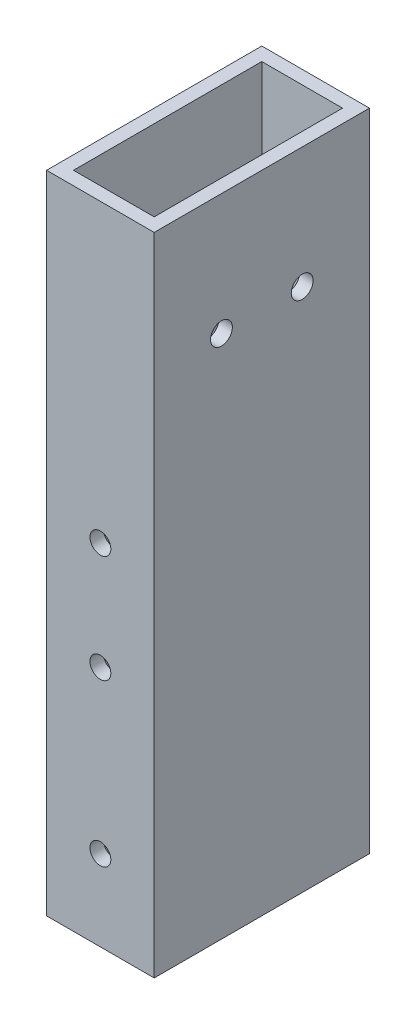
ISO-10303-21;
HEADER;
FILE_DESCRIPTION(('STEP AP214'),'2;1');
FILE_NAME('part.step','',(''),(''),'','','');
FILE_SCHEMA(('AUTOMOTIVE_DESIGN { 1 0 10303 214 1 1 1 1 }'));
ENDSEC;
DATA;
#1=APPLICATION_CONTEXT('core data for automotive mechanical design processes');
#2=APPLICATION_PROTOCOL_DEFINITION('international standard','automotive_design',2000,#1);
#3=PRODUCT_CONTEXT('',#1,'mechanical');
#4=PRODUCT('Part','Part','',(#3));
#5=PRODUCT_RELATED_PRODUCT_CATEGORY('part','',(#4));
#6=PRODUCT_DEFINITION_FORMATION('','',#4);
#7=PRODUCT_DEFINITION_CONTEXT('part definition',#1,'design');
#8=PRODUCT_DEFINITION('design','',#6,#7);
#9=PRODUCT_DEFINITION_SHAPE('','',#8);
#10=(LENGTH_UNIT() NAMED_UNIT(*) SI_UNIT(.MILLI.,.METRE.));
#11=(NAMED_UNIT(*) PLANE_ANGLE_UNIT() SI_UNIT($,.RADIAN.));
#12=(NAMED_UNIT(*) SI_UNIT($,.STERADIAN.) SOLID_ANGLE_UNIT());
#13=UNCERTAINTY_MEASURE_WITH_UNIT(LENGTH_MEASURE(1.E-05),#10,'distance_accuracy_value','');
#14=(GEOMETRIC_REPRESENTATION_CONTEXT(3) GLOBAL_UNCERTAINTY_ASSIGNED_CONTEXT((#13)) GLOBAL_UNIT_ASSIGNED_CONTEXT((#10,
#11,#12)) REPRESENTATION_CONTEXT('',''));
#15=CARTESIAN_POINT('',(0.,0.,0.));
#16=DIRECTION('',(0.,0.,1.));
#17=DIRECTION('',(1.,0.,0.));
#18=AXIS2_PLACEMENT_3D('',#15,#16,#17);
#19=CARTESIAN_POINT('',(0.,152.4,0.));
#20=DIRECTION('',(0.,-1.,0.));
#21=DIRECTION('',(0.,0.,-1.));
#22=AXIS2_PLACEMENT_3D('',#19,#20,#21);
#23=PLANE('',#22);
#24=DIRECTION('',(0.,0.,1.));
#25=VECTOR('',#24,1.);
#26=CARTESIAN_POINT('',(0.,152.4,0.));
#27=LINE('',#26,#25);
#28=CARTESIAN_POINT('',(0.,152.4,-50.8));
#29=VERTEX_POINT('',#28);
#30=CARTESIAN_POINT('',(0.,152.4,0.));
#31=VERTEX_POINT('',#30);
#32=EDGE_CURVE('E141',#29,#31,#27,.T.);
#33=ORIENTED_EDGE('',*,*,#32,.T.);
#34=DIRECTION('',(1.,0.,0.));
#35=VECTOR('',#34,1.);
#36=CARTESIAN_POINT('',(0.,152.4,0.));
#37=LINE('',#36,#35);
#38=CARTESIAN_POINT('',(25.4,152.4,0.));
#39=VERTEX_POINT('',#38);
#40=EDGE_CURVE('E144',#31,#39,#37,.T.);
#41=ORIENTED_EDGE('',*,*,#40,.T.);
#42=DIRECTION('',(0.,0.,-1.));
#43=VECTOR('',#42,1.);
#44=CARTESIAN_POINT('',(25.4,152.4,0.));
#45=LINE('',#44,#43);
#46=CARTESIAN_POINT('',(25.4,152.4,-50.8));
#47=VERTEX_POINT('',#46);
#48=EDGE_CURVE('E147',#39,#47,#45,.T.);
#49=ORIENTED_EDGE('',*,*,#48,.T.);
#50=DIRECTION('',(-1.,0.,0.));
#51=VECTOR('',#50,1.);
#52=CARTESIAN_POINT('',(0.,152.4,-50.8));
#53=LINE('',#52,#51);
#54=EDGE_CURVE('E149',#47,#29,#53,.T.);
#55=ORIENTED_EDGE('',*,*,#54,.T.);
#56=EDGE_LOOP('',(#33,#41,#49,#55));
#57=FACE_BOUND('',#56,.T.);
#58=DIRECTION('',(0.,0.,1.));
#59=VECTOR('',#58,1.);
#60=CARTESIAN_POINT('',(3.175,152.4,-3.175));
#61=LINE('',#60,#59);
#62=CARTESIAN_POINT('',(3.175,152.4,-47.625));
#63=VERTEX_POINT('',#62);
#64=CARTESIAN_POINT('',(3.175,152.4,-3.175));
#65=VERTEX_POINT('',#64);
#66=EDGE_CURVE('E103',#63,#65,#61,.T.);
#67=ORIENTED_EDGE('',*,*,#66,.F.);
#68=DIRECTION('',(-1.,0.,0.));
#69=VECTOR('',#68,1.);
#70=CARTESIAN_POINT('',(3.175,152.4,-47.625));
#71=LINE('',#70,#69);
#72=CARTESIAN_POINT('',(22.225,152.4,-47.625));
#73=VERTEX_POINT('',#72);
#74=EDGE_CURVE('E125',#73,#63,#71,.T.);
#75=ORIENTED_EDGE('',*,*,#74,.F.);
#76=DIRECTION('',(0.,0.,-1.));
#77=VECTOR('',#76,1.);
#78=CARTESIAN_POINT('',(22.225,152.4,-3.175));
#79=LINE('',#78,#77);
#80=CARTESIAN_POINT('',(22.225,152.4,-3.175));
#81=VERTEX_POINT('',#80);
#82=EDGE_CURVE('E123',#81,#73,#79,.T.);
#83=ORIENTED_EDGE('',*,*,#82,.F.);
#84=DIRECTION('',(1.,0.,0.));
#85=VECTOR('',#84,1.);
#86=CARTESIAN_POINT('',(3.175,152.4,-3.175));
#87=LINE('',#86,#85);
#88=EDGE_CURVE('E111',#65,#81,#87,.T.);
#89=ORIENTED_EDGE('',*,*,#88,.F.);
#90=EDGE_LOOP('',(#67,#75,#83,#89));
#91=FACE_BOUND('',#90,.T.);
#92=ADVANCED_FACE('F36',(#57,#91),#23,.F.);
#93=CARTESIAN_POINT('',(0.,0.,0.));
#94=DIRECTION('',(0.,-1.,0.));
#95=DIRECTION('',(0.,0.,-1.));
#96=AXIS2_PLACEMENT_3D('',#93,#94,#95);
#97=PLANE('',#96);
#98=DIRECTION('',(0.,0.,1.));
#99=VECTOR('',#98,1.);
#100=CARTESIAN_POINT('',(0.,0.,0.));
#101=LINE('',#100,#99);
#102=CARTESIAN_POINT('',(0.,0.,-50.8));
#103=VERTEX_POINT('',#102);
#104=CARTESIAN_POINT('',(0.,0.,0.));
#105=VERTEX_POINT('',#104);
#106=EDGE_CURVE('E119',#103,#105,#101,.T.);
#107=ORIENTED_EDGE('',*,*,#106,.F.);
#108=DIRECTION('',(-1.,0.,0.));
#109=VECTOR('',#108,1.);
#110=CARTESIAN_POINT('',(0.,0.,-50.8));
#111=LINE('',#110,#109);
#112=CARTESIAN_POINT('',(25.4,0.,-50.8));
#113=VERTEX_POINT('',#112);
#114=EDGE_CURVE('E145',#113,#103,#111,.T.);
#115=ORIENTED_EDGE('',*,*,#114,.F.);
#116=DIRECTION('',(0.,0.,-1.));
#117=VECTOR('',#116,1.);
#118=CARTESIAN_POINT('',(25.4,0.,0.));
#119=LINE('',#118,#117);
#120=CARTESIAN_POINT('',(25.4,0.,0.));
#121=VERTEX_POINT('',#120);
#122=EDGE_CURVE('E156',#121,#113,#119,.T.);
#123=ORIENTED_EDGE('',*,*,#122,.F.);
#124=DIRECTION('',(1.,0.,0.));
#125=VECTOR('',#124,1.);
#126=CARTESIAN_POINT('',(0.,0.,0.));
#127=LINE('',#126,#125);
#128=EDGE_CURVE('E154',#105,#121,#127,.T.);
#129=ORIENTED_EDGE('',*,*,#128,.F.);
#130=EDGE_LOOP('',(#107,#115,#123,#129));
#131=FACE_BOUND('',#130,.T.);
#132=DIRECTION('',(-1.,0.,0.));
#133=VECTOR('',#132,1.);
#134=CARTESIAN_POINT('',(3.175,0.,-47.625));
#135=LINE('',#134,#133);
#136=CARTESIAN_POINT('',(22.225,0.,-47.625));
#137=VERTEX_POINT('',#136);
#138=CARTESIAN_POINT('',(3.175,0.,-47.625));
#139=VERTEX_POINT('',#138);
#140=EDGE_CURVE('E112',#137,#139,#135,.T.);
#141=ORIENTED_EDGE('',*,*,#140,.T.);
#142=DIRECTION('',(0.,0.,1.));
#143=VECTOR('',#142,1.);
#144=CARTESIAN_POINT('',(3.175,0.,-3.175));
#145=LINE('',#144,#143);
#146=CARTESIAN_POINT('',(3.175,0.,-3.175));
#147=VERTEX_POINT('',#146);
#148=EDGE_CURVE('E61',#139,#147,#145,.T.);
#149=ORIENTED_EDGE('',*,*,#148,.T.);
#150=DIRECTION('',(1.,0.,0.));
#151=VECTOR('',#150,1.);
#152=CARTESIAN_POINT('',(3.175,0.,-3.175));
#153=LINE('',#152,#151);
#154=CARTESIAN_POINT('',(22.225,0.,-3.175));
#155=VERTEX_POINT('',#154);
#156=EDGE_CURVE('E118',#147,#155,#153,.T.);
#157=ORIENTED_EDGE('',*,*,#156,.T.);
#158=DIRECTION('',(0.,0.,-1.));
#159=VECTOR('',#158,1.);
#160=CARTESIAN_POINT('',(22.225,0.,-3.175));
#161=LINE('',#160,#159);
#162=EDGE_CURVE('E133',#155,#137,#161,.T.);
#163=ORIENTED_EDGE('',*,*,#162,.T.);
#164=EDGE_LOOP('',(#141,#149,#157,#163));
#165=FACE_BOUND('',#164,.T.);
#166=ADVANCED_FACE('F216',(#131,#165),#97,.T.);
#167=CARTESIAN_POINT('',(0.,152.4,0.));
#168=DIRECTION('',(1.,0.,0.));
#169=DIRECTION('',(0.,0.,-1.));
#170=AXIS2_PLACEMENT_3D('',#167,#168,#169);
#171=PLANE('',#170);
#172=CARTESIAN_POINT('',(0.,123.822021435795,-34.9249999999998));
#173=DIRECTION('',(-1.,0.,0.));
#174=DIRECTION('',(0.,0.,1.));
#175=AXIS2_PLACEMENT_3D('',#172,#173,#174);
#176=CIRCLE('',#175,2.57975099999999);
#177=CARTESIAN_POINT('',(0.,123.822021435795,-32.3452489999998));
#178=VERTEX_POINT('',#177);
#179=EDGE_CURVE('E303',#178,#178,#176,.T.);
#180=ORIENTED_EDGE('',*,*,#179,.F.);
#181=EDGE_LOOP('',(#180));
#182=FACE_BOUND('',#181,.T.);
#183=CARTESIAN_POINT('',(0.,123.822021435795,-15.8749999999998));
#184=DIRECTION('',(-1.,0.,0.));
#185=DIRECTION('',(0.,0.,1.));
#186=AXIS2_PLACEMENT_3D('',#183,#184,#185);
#187=CIRCLE('',#186,2.57975099999999);
#188=CARTESIAN_POINT('',(0.,123.822021435795,-13.2952489999998));
#189=VERTEX_POINT('',#188);
#190=EDGE_CURVE('E311',#189,#189,#187,.T.);
#191=ORIENTED_EDGE('',*,*,#190,.F.);
#192=EDGE_LOOP('',(#191));
#193=FACE_BOUND('',#192,.T.);
#194=ORIENTED_EDGE('',*,*,#106,.T.);
#195=DIRECTION('',(0.,-1.,0.));
#196=VECTOR('',#195,1.);
#197=CARTESIAN_POINT('',(0.,152.4,0.));
#198=LINE('',#197,#196);
#199=EDGE_CURVE('E11',#31,#105,#198,.T.);
#200=ORIENTED_EDGE('',*,*,#199,.F.);
#201=ORIENTED_EDGE('',*,*,#32,.F.);
#202=DIRECTION('',(0.,-1.,0.));
#203=VECTOR('',#202,1.);
#204=CARTESIAN_POINT('',(0.,152.4,-50.8));
#205=LINE('',#204,#203);
#206=EDGE_CURVE('E151',#29,#103,#205,.T.);
#207=ORIENTED_EDGE('',*,*,#206,.T.);
#208=EDGE_LOOP('',(#194,#200,#201,#207));
#209=FACE_BOUND('',#208,.T.);
#210=ADVANCED_FACE('F38',(#182,#193,#209),#171,.F.);
#211=CARTESIAN_POINT('',(0.,152.4,0.));
#212=DIRECTION('',(0.,0.,-1.));
#213=DIRECTION('',(-1.,0.,0.));
#214=AXIS2_PLACEMENT_3D('',#211,#212,#213);
#215=PLANE('',#214);
#216=CARTESIAN_POINT('',(12.7,57.15,0.));
#217=DIRECTION('',(0.,0.,1.));
#218=DIRECTION('',(1.,0.,0.));
#219=AXIS2_PLACEMENT_3D('',#216,#217,#218);
#220=CIRCLE('',#219,2.46380000000001);
#221=CARTESIAN_POINT('',(15.1638,57.15,0.));
#222=VERTEX_POINT('',#221);
#223=EDGE_CURVE('E241',#222,#222,#220,.T.);
#224=ORIENTED_EDGE('',*,*,#223,.F.);
#225=EDGE_LOOP('',(#224));
#226=FACE_BOUND('',#225,.T.);
#227=CARTESIAN_POINT('',(12.7,19.05,0.));
#228=DIRECTION('',(0.,0.,1.));
#229=DIRECTION('',(1.,0.,0.));
#230=AXIS2_PLACEMENT_3D('',#227,#228,#229);
#231=CIRCLE('',#230,2.4638);
#232=CARTESIAN_POINT('',(15.1638,19.05,0.));
#233=VERTEX_POINT('',#232);
#234=EDGE_CURVE('E187',#233,#233,#231,.T.);
#235=ORIENTED_EDGE('',*,*,#234,.F.);
#236=EDGE_LOOP('',(#235));
#237=FACE_BOUND('',#236,.T.);
#238=CARTESIAN_POINT('',(12.7,82.55,0.));
#239=DIRECTION('',(0.,0.,1.));
#240=DIRECTION('',(1.,0.,0.));
#241=AXIS2_PLACEMENT_3D('',#238,#239,#240);
#242=CIRCLE('',#241,2.4638);
#243=CARTESIAN_POINT('',(15.1638,82.55,0.));
#244=VERTEX_POINT('',#243);
#245=EDGE_CURVE('E180',#244,#244,#242,.T.);
#246=ORIENTED_EDGE('',*,*,#245,.F.);
#247=EDGE_LOOP('',(#246));
#248=FACE_BOUND('',#247,.T.);
#249=ORIENTED_EDGE('',*,*,#128,.T.);
#250=DIRECTION('',(0.,-1.,0.));
#251=VECTOR('',#250,1.);
#252=CARTESIAN_POINT('',(25.4,152.4,0.));
#253=LINE('',#252,#251);
#254=EDGE_CURVE('E45',#39,#121,#253,.T.);
#255=ORIENTED_EDGE('',*,*,#254,.F.);
#256=ORIENTED_EDGE('',*,*,#40,.F.);
#257=ORIENTED_EDGE('',*,*,#199,.T.);
#258=EDGE_LOOP('',(#249,#255,#256,#257));
#259=FACE_BOUND('',#258,.T.);
#260=ADVANCED_FACE('F230',(#226,#237,#248,#259),#215,.F.);
#261=CARTESIAN_POINT('',(25.4,152.4,0.));
#262=DIRECTION('',(-1.,0.,0.));
#263=DIRECTION('',(0.,0.,1.));
#264=AXIS2_PLACEMENT_3D('',#261,#262,#263);
#265=PLANE('',#264);
#266=CARTESIAN_POINT('',(25.4,123.822021435795,-34.9249999999998));
#267=DIRECTION('',(-1.,0.,0.));
#268=DIRECTION('',(0.,0.,1.));
#269=AXIS2_PLACEMENT_3D('',#266,#267,#268);
#270=CIRCLE('',#269,2.57975099999999);
#271=CARTESIAN_POINT('',(25.4,123.822021435795,-32.3452489999998));
#272=VERTEX_POINT('',#271);
#273=EDGE_CURVE('E302',#272,#272,#270,.T.);
#274=ORIENTED_EDGE('',*,*,#273,.T.);
#275=EDGE_LOOP('',(#274));
#276=FACE_BOUND('',#275,.T.);
#277=CARTESIAN_POINT('',(25.4,123.822021435795,-15.8749999999998));
#278=DIRECTION('',(-1.,0.,0.));
#279=DIRECTION('',(0.,0.,1.));
#280=AXIS2_PLACEMENT_3D('',#277,#278,#279);
#281=CIRCLE('',#280,2.57975099999999);
#282=CARTESIAN_POINT('',(25.4,123.822021435795,-13.2952489999998));
#283=VERTEX_POINT('',#282);
#284=EDGE_CURVE('E314',#283,#283,#281,.T.);
#285=ORIENTED_EDGE('',*,*,#284,.T.);
#286=EDGE_LOOP('',(#285));
#287=FACE_BOUND('',#286,.T.);
#288=ORIENTED_EDGE('',*,*,#122,.T.);
#289=DIRECTION('',(0.,-1.,0.));
#290=VECTOR('',#289,1.);
#291=CARTESIAN_POINT('',(25.4,152.4,-50.8));
#292=LINE('',#291,#290);
#293=EDGE_CURVE('E161',#47,#113,#292,.T.);
#294=ORIENTED_EDGE('',*,*,#293,.F.);
#295=ORIENTED_EDGE('',*,*,#48,.F.);
#296=ORIENTED_EDGE('',*,*,#254,.T.);
#297=EDGE_LOOP('',(#288,#294,#295,#296));
#298=FACE_BOUND('',#297,.T.);
#299=ADVANCED_FACE('F227',(#276,#287,#298),#265,.F.);
#300=CARTESIAN_POINT('',(0.,152.4,-50.8));
#301=DIRECTION('',(0.,0.,1.));
#302=DIRECTION('',(1.,0.,0.));
#303=AXIS2_PLACEMENT_3D('',#300,#301,#302);
#304=PLANE('',#303);
#305=CARTESIAN_POINT('',(12.7,57.15,-50.8));
#306=DIRECTION('',(0.,0.,1.));
#307=DIRECTION('',(1.,0.,0.));
#308=AXIS2_PLACEMENT_3D('',#305,#306,#307);
#309=CIRCLE('',#308,2.46380000000001);
#310=CARTESIAN_POINT('',(15.1638,57.15,-50.8));
#311=VERTEX_POINT('',#310);
#312=EDGE_CURVE('E173',#311,#311,#309,.T.);
#313=ORIENTED_EDGE('',*,*,#312,.T.);
#314=EDGE_LOOP('',(#313));
#315=FACE_BOUND('',#314,.T.);
#316=CARTESIAN_POINT('',(12.7,19.05,-50.8));
#317=DIRECTION('',(0.,0.,1.));
#318=DIRECTION('',(1.,0.,0.));
#319=AXIS2_PLACEMENT_3D('',#316,#317,#318);
#320=CIRCLE('',#319,2.4638);
#321=CARTESIAN_POINT('',(15.1638,19.05,-50.8));
#322=VERTEX_POINT('',#321);
#323=EDGE_CURVE('E325',#322,#322,#320,.T.);
#324=ORIENTED_EDGE('',*,*,#323,.T.);
#325=EDGE_LOOP('',(#324));
#326=FACE_BOUND('',#325,.T.);
#327=CARTESIAN_POINT('',(12.7,82.55,-50.8));
#328=DIRECTION('',(0.,0.,1.));
#329=DIRECTION('',(1.,0.,0.));
#330=AXIS2_PLACEMENT_3D('',#327,#328,#329);
#331=CIRCLE('',#330,2.4638);
#332=CARTESIAN_POINT('',(15.1638,82.55,-50.8));
#333=VERTEX_POINT('',#332);
#334=EDGE_CURVE('E169',#333,#333,#331,.T.);
#335=ORIENTED_EDGE('',*,*,#334,.T.);
#336=EDGE_LOOP('',(#335));
#337=FACE_BOUND('',#336,.T.);
#338=ORIENTED_EDGE('',*,*,#114,.T.);
#339=ORIENTED_EDGE('',*,*,#206,.F.);
#340=ORIENTED_EDGE('',*,*,#54,.F.);
#341=ORIENTED_EDGE('',*,*,#293,.T.);
#342=EDGE_LOOP('',(#338,#339,#340,#341));
#343=FACE_BOUND('',#342,.T.);
#344=ADVANCED_FACE('F210',(#315,#326,#337,#343),#304,.F.);
#345=CARTESIAN_POINT('',(3.175,152.4,-3.175));
#346=DIRECTION('',(1.,0.,0.));
#347=DIRECTION('',(0.,0.,-1.));
#348=AXIS2_PLACEMENT_3D('',#345,#346,#347);
#349=PLANE('',#348);
#350=CARTESIAN_POINT('',(3.175,123.822021435795,-34.9249999999998));
#351=DIRECTION('',(1.,0.,0.));
#352=DIRECTION('',(0.,0.,-1.));
#353=AXIS2_PLACEMENT_3D('',#350,#351,#352);
#354=CIRCLE('',#353,2.57975099999999);
#355=CARTESIAN_POINT('',(3.175,123.822021435795,-37.5047509999998));
#356=VERTEX_POINT('',#355);
#357=EDGE_CURVE('E305',#356,#356,#354,.T.);
#358=ORIENTED_EDGE('',*,*,#357,.F.);
#359=EDGE_LOOP('',(#358));
#360=FACE_BOUND('',#359,.T.);
#361=CARTESIAN_POINT('',(3.175,123.822021435795,-15.8749999999998));
#362=DIRECTION('',(1.,0.,0.));
#363=DIRECTION('',(0.,0.,-1.));
#364=AXIS2_PLACEMENT_3D('',#361,#362,#363);
#365=CIRCLE('',#364,2.57975099999999);
#366=CARTESIAN_POINT('',(3.175,123.822021435795,-18.4547509999998));
#367=VERTEX_POINT('',#366);
#368=EDGE_CURVE('E320',#367,#367,#365,.T.);
#369=ORIENTED_EDGE('',*,*,#368,.F.);
#370=EDGE_LOOP('',(#369));
#371=FACE_BOUND('',#370,.T.);
#372=ORIENTED_EDGE('',*,*,#148,.F.);
#373=DIRECTION('',(0.,-1.,0.));
#374=VECTOR('',#373,1.);
#375=CARTESIAN_POINT('',(3.175,152.4,-47.625));
#376=LINE('',#375,#374);
#377=EDGE_CURVE('E107',#63,#139,#376,.T.);
#378=ORIENTED_EDGE('',*,*,#377,.F.);
#379=ORIENTED_EDGE('',*,*,#66,.T.);
#380=DIRECTION('',(0.,-1.,0.));
#381=VECTOR('',#380,1.);
#382=CARTESIAN_POINT('',(3.175,152.4,-3.175));
#383=LINE('',#382,#381);
#384=EDGE_CURVE('E106',#65,#147,#383,.T.);
#385=ORIENTED_EDGE('',*,*,#384,.T.);
#386=EDGE_LOOP('',(#372,#378,#379,#385));
#387=FACE_BOUND('',#386,.T.);
#388=ADVANCED_FACE('F105',(#360,#371,#387),#349,.T.);
#389=CARTESIAN_POINT('',(3.175,152.4,-3.175));
#390=DIRECTION('',(0.,0.,-1.));
#391=DIRECTION('',(-1.,0.,0.));
#392=AXIS2_PLACEMENT_3D('',#389,#390,#391);
#393=PLANE('',#392);
#394=CARTESIAN_POINT('',(12.7,57.15,-3.175));
#395=DIRECTION('',(0.,0.,-1.));
#396=DIRECTION('',(-1.,0.,0.));
#397=AXIS2_PLACEMENT_3D('',#394,#395,#396);
#398=CIRCLE('',#397,2.46380000000001);
#399=CARTESIAN_POINT('',(10.2362,57.15,-3.175));
#400=VERTEX_POINT('',#399);
#401=EDGE_CURVE('E176',#400,#400,#398,.T.);
#402=ORIENTED_EDGE('',*,*,#401,.F.);
#403=EDGE_LOOP('',(#402));
#404=FACE_BOUND('',#403,.T.);
#405=CARTESIAN_POINT('',(12.7,19.05,-3.175));
#406=DIRECTION('',(0.,0.,-1.));
#407=DIRECTION('',(-1.,0.,0.));
#408=AXIS2_PLACEMENT_3D('',#405,#406,#407);
#409=CIRCLE('',#408,2.4638);
#410=CARTESIAN_POINT('',(10.2362,19.05,-3.175));
#411=VERTEX_POINT('',#410);
#412=EDGE_CURVE('E172',#411,#411,#409,.T.);
#413=ORIENTED_EDGE('',*,*,#412,.F.);
#414=EDGE_LOOP('',(#413));
#415=FACE_BOUND('',#414,.T.);
#416=CARTESIAN_POINT('',(12.7,82.55,-3.175));
#417=DIRECTION('',(0.,0.,-1.));
#418=DIRECTION('',(-1.,0.,0.));
#419=AXIS2_PLACEMENT_3D('',#416,#417,#418);
#420=CIRCLE('',#419,2.4638);
#421=CARTESIAN_POINT('',(10.2362,82.55,-3.175));
#422=VERTEX_POINT('',#421);
#423=EDGE_CURVE('E131',#422,#422,#420,.T.);
#424=ORIENTED_EDGE('',*,*,#423,.F.);
#425=EDGE_LOOP('',(#424));
#426=FACE_BOUND('',#425,.T.);
#427=ORIENTED_EDGE('',*,*,#156,.F.);
#428=ORIENTED_EDGE('',*,*,#384,.F.);
#429=ORIENTED_EDGE('',*,*,#88,.T.);
#430=DIRECTION('',(0.,-1.,0.));
#431=VECTOR('',#430,1.);
#432=CARTESIAN_POINT('',(22.225,152.4,-3.175));
#433=LINE('',#432,#431);
#434=EDGE_CURVE('E120',#81,#155,#433,.T.);
#435=ORIENTED_EDGE('',*,*,#434,.T.);
#436=EDGE_LOOP('',(#427,#428,#429,#435));
#437=FACE_BOUND('',#436,.T.);
#438=ADVANCED_FACE('F115',(#404,#415,#426,#437),#393,.T.);
#439=CARTESIAN_POINT('',(22.225,152.4,-3.175));
#440=DIRECTION('',(-1.,0.,0.));
#441=DIRECTION('',(0.,0.,1.));
#442=AXIS2_PLACEMENT_3D('',#439,#440,#441);
#443=PLANE('',#442);
#444=CARTESIAN_POINT('',(22.225,123.822021435795,-34.9249999999998));
#445=DIRECTION('',(-1.,0.,0.));
#446=DIRECTION('',(0.,0.,1.));
#447=AXIS2_PLACEMENT_3D('',#444,#445,#446);
#448=CIRCLE('',#447,2.57975099999999);
#449=CARTESIAN_POINT('',(22.225,123.822021435795,-32.3452489999998));
#450=VERTEX_POINT('',#449);
#451=EDGE_CURVE('E40',#450,#450,#448,.T.);
#452=ORIENTED_EDGE('',*,*,#451,.F.);
#453=EDGE_LOOP('',(#452));
#454=FACE_BOUND('',#453,.T.);
#455=CARTESIAN_POINT('',(22.225,123.822021435795,-15.8749999999998));
#456=DIRECTION('',(-1.,0.,0.));
#457=DIRECTION('',(0.,0.,1.));
#458=AXIS2_PLACEMENT_3D('',#455,#456,#457);
#459=CIRCLE('',#458,2.57975099999999);
#460=CARTESIAN_POINT('',(22.225,123.822021435795,-13.2952489999998));
#461=VERTEX_POINT('',#460);
#462=EDGE_CURVE('E317',#461,#461,#459,.T.);
#463=ORIENTED_EDGE('',*,*,#462,.F.);
#464=EDGE_LOOP('',(#463));
#465=FACE_BOUND('',#464,.T.);
#466=ORIENTED_EDGE('',*,*,#162,.F.);
#467=ORIENTED_EDGE('',*,*,#434,.F.);
#468=ORIENTED_EDGE('',*,*,#82,.T.);
#469=DIRECTION('',(0.,-1.,0.));
#470=VECTOR('',#469,1.);
#471=CARTESIAN_POINT('',(22.225,152.4,-47.625));
#472=LINE('',#471,#470);
#473=EDGE_CURVE('E53',#73,#137,#472,.T.);
#474=ORIENTED_EDGE('',*,*,#473,.T.);
#475=EDGE_LOOP('',(#466,#467,#468,#474));
#476=FACE_BOUND('',#475,.T.);
#477=ADVANCED_FACE('F200',(#454,#465,#476),#443,.T.);
#478=CARTESIAN_POINT('',(3.175,152.4,-47.625));
#479=DIRECTION('',(0.,0.,1.));
#480=DIRECTION('',(1.,0.,0.));
#481=AXIS2_PLACEMENT_3D('',#478,#479,#480);
#482=PLANE('',#481);
#483=CARTESIAN_POINT('',(12.7,57.15,-47.625));
#484=DIRECTION('',(0.,0.,1.));
#485=DIRECTION('',(1.,0.,0.));
#486=AXIS2_PLACEMENT_3D('',#483,#484,#485);
#487=CIRCLE('',#486,2.46380000000001);
#488=CARTESIAN_POINT('',(15.1638,57.15,-47.625));
#489=VERTEX_POINT('',#488);
#490=EDGE_CURVE('E174',#489,#489,#487,.T.);
#491=ORIENTED_EDGE('',*,*,#490,.F.);
#492=EDGE_LOOP('',(#491));
#493=FACE_BOUND('',#492,.T.);
#494=CARTESIAN_POINT('',(12.7,19.05,-47.625));
#495=DIRECTION('',(0.,0.,1.));
#496=DIRECTION('',(1.,0.,0.));
#497=AXIS2_PLACEMENT_3D('',#494,#495,#496);
#498=CIRCLE('',#497,2.4638);
#499=CARTESIAN_POINT('',(15.1638,19.05,-47.625));
#500=VERTEX_POINT('',#499);
#501=EDGE_CURVE('E170',#500,#500,#498,.T.);
#502=ORIENTED_EDGE('',*,*,#501,.F.);
#503=EDGE_LOOP('',(#502));
#504=FACE_BOUND('',#503,.T.);
#505=CARTESIAN_POINT('',(12.7,82.55,-47.625));
#506=DIRECTION('',(0.,0.,1.));
#507=DIRECTION('',(1.,0.,0.));
#508=AXIS2_PLACEMENT_3D('',#505,#506,#507);
#509=CIRCLE('',#508,2.4638);
#510=CARTESIAN_POINT('',(15.1638,82.55,-47.625));
#511=VERTEX_POINT('',#510);
#512=EDGE_CURVE('E166',#511,#511,#509,.T.);
#513=ORIENTED_EDGE('',*,*,#512,.F.);
#514=EDGE_LOOP('',(#513));
#515=FACE_BOUND('',#514,.T.);
#516=ORIENTED_EDGE('',*,*,#140,.F.);
#517=ORIENTED_EDGE('',*,*,#473,.F.);
#518=ORIENTED_EDGE('',*,*,#74,.T.);
#519=ORIENTED_EDGE('',*,*,#377,.T.);
#520=EDGE_LOOP('',(#516,#517,#518,#519));
#521=FACE_BOUND('',#520,.T.);
#522=ADVANCED_FACE('F207',(#493,#504,#515,#521),#482,.T.);
#523=CARTESIAN_POINT('',(12.7,82.55,-50.8));
#524=DIRECTION('',(0.,0.,1.));
#525=DIRECTION('',(1.,0.,0.));
#526=AXIS2_PLACEMENT_3D('',#523,#524,#525);
#527=CYLINDRICAL_SURFACE('',#526,2.4638);
#528=ORIENTED_EDGE('',*,*,#512,.T.);
#529=EDGE_LOOP('',(#528));
#530=FACE_BOUND('',#529,.T.);
#531=ORIENTED_EDGE('',*,*,#334,.F.);
#532=EDGE_LOOP('',(#531));
#533=FACE_BOUND('',#532,.T.);
#534=ADVANCED_FACE('F263',(#530,#533),#527,.F.);
#535=ORIENTED_EDGE('',*,*,#423,.T.);
#536=EDGE_LOOP('',(#535));
#537=FACE_BOUND('',#536,.T.);
#538=ORIENTED_EDGE('',*,*,#245,.T.);
#539=EDGE_LOOP('',(#538));
#540=FACE_BOUND('',#539,.T.);
#541=ADVANCED_FACE('F196',(#537,#540),#527,.F.);
#542=CARTESIAN_POINT('',(12.7,19.05,-50.8));
#543=DIRECTION('',(0.,0.,1.));
#544=DIRECTION('',(1.,0.,0.));
#545=AXIS2_PLACEMENT_3D('',#542,#543,#544);
#546=CYLINDRICAL_SURFACE('',#545,2.4638);
#547=ORIENTED_EDGE('',*,*,#501,.T.);
#548=EDGE_LOOP('',(#547));
#549=FACE_BOUND('',#548,.T.);
#550=ORIENTED_EDGE('',*,*,#323,.F.);
#551=EDGE_LOOP('',(#550));
#552=FACE_BOUND('',#551,.T.);
#553=ADVANCED_FACE('F273',(#549,#552),#546,.F.);
#554=CARTESIAN_POINT('',(12.7,57.15,-50.8));
#555=DIRECTION('',(0.,0.,1.));
#556=DIRECTION('',(1.,0.,0.));
#557=AXIS2_PLACEMENT_3D('',#554,#555,#556);
#558=CYLINDRICAL_SURFACE('',#557,2.46380000000001);
#559=ORIENTED_EDGE('',*,*,#490,.T.);
#560=EDGE_LOOP('',(#559));
#561=FACE_BOUND('',#560,.T.);
#562=ORIENTED_EDGE('',*,*,#312,.F.);
#563=EDGE_LOOP('',(#562));
#564=FACE_BOUND('',#563,.T.);
#565=ADVANCED_FACE('F276',(#561,#564),#558,.F.);
#566=ORIENTED_EDGE('',*,*,#412,.T.);
#567=EDGE_LOOP('',(#566));
#568=FACE_BOUND('',#567,.T.);
#569=ORIENTED_EDGE('',*,*,#234,.T.);
#570=EDGE_LOOP('',(#569));
#571=FACE_BOUND('',#570,.T.);
#572=ADVANCED_FACE('F278',(#568,#571),#546,.F.);
#573=ORIENTED_EDGE('',*,*,#401,.T.);
#574=EDGE_LOOP('',(#573));
#575=FACE_BOUND('',#574,.T.);
#576=ORIENTED_EDGE('',*,*,#223,.T.);
#577=EDGE_LOOP('',(#576));
#578=FACE_BOUND('',#577,.T.);
#579=ADVANCED_FACE('F281',(#575,#578),#558,.F.);
#580=CARTESIAN_POINT('',(0.,123.822021435795,-15.8749999999998));
#581=DIRECTION('',(-1.,0.,0.));
#582=DIRECTION('',(0.,0.,1.));
#583=AXIS2_PLACEMENT_3D('',#580,#581,#582);
#584=CYLINDRICAL_SURFACE('',#583,2.57975099999999);
#585=ORIENTED_EDGE('',*,*,#462,.T.);
#586=EDGE_LOOP('',(#585));
#587=FACE_BOUND('',#586,.T.);
#588=ORIENTED_EDGE('',*,*,#284,.F.);
#589=EDGE_LOOP('',(#588));
#590=FACE_BOUND('',#589,.T.);
#591=ADVANCED_FACE('F282',(#587,#590),#584,.F.);
#592=ORIENTED_EDGE('',*,*,#368,.T.);
#593=EDGE_LOOP('',(#592));
#594=FACE_BOUND('',#593,.T.);
#595=ORIENTED_EDGE('',*,*,#190,.T.);
#596=EDGE_LOOP('',(#595));
#597=FACE_BOUND('',#596,.T.);
#598=ADVANCED_FACE('F285',(#594,#597),#584,.F.);
#599=CARTESIAN_POINT('',(0.,123.822021435795,-34.9249999999998));
#600=DIRECTION('',(-1.,0.,0.));
#601=DIRECTION('',(0.,0.,1.));
#602=AXIS2_PLACEMENT_3D('',#599,#600,#601);
#603=CYLINDRICAL_SURFACE('',#602,2.57975099999999);
#604=ORIENTED_EDGE('',*,*,#451,.T.);
#605=EDGE_LOOP('',(#604));
#606=FACE_BOUND('',#605,.T.);
#607=ORIENTED_EDGE('',*,*,#273,.F.);
#608=EDGE_LOOP('',(#607));
#609=FACE_BOUND('',#608,.T.);
#610=ADVANCED_FACE('F287',(#606,#609),#603,.F.);
#611=ORIENTED_EDGE('',*,*,#357,.T.);
#612=EDGE_LOOP('',(#611));
#613=FACE_BOUND('',#612,.T.);
#614=ORIENTED_EDGE('',*,*,#179,.T.);
#615=EDGE_LOOP('',(#614));
#616=FACE_BOUND('',#615,.T.);
#617=ADVANCED_FACE('F289',(#613,#616),#603,.F.);
#618=CLOSED_SHELL('',(#92,#166,#210,#260,#299,#344,#388,#438,#477,#522,#534,#541,#553,#565,#572,
#579,#591,#598,#610,#617));
#619=MANIFOLD_SOLID_BREP('B2',#618);
#620=ADVANCED_BREP_SHAPE_REPRESENTATION('',(#18,#619),#14);
#621=SHAPE_DEFINITION_REPRESENTATION(#9,#620);
ENDSEC;
END-ISO-10303-21;
